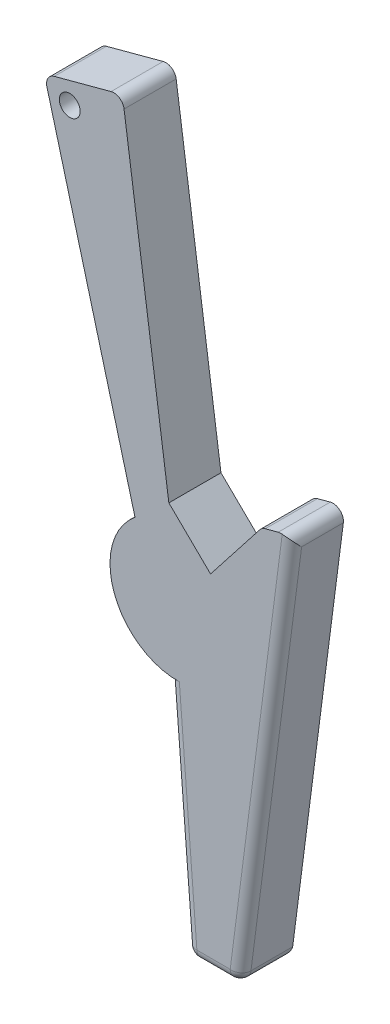
ISO-10303-21;
HEADER;
FILE_DESCRIPTION(('STEP AP214'),'2;1');
FILE_NAME('part.step','',(''),(''),'','','');
FILE_SCHEMA(('AUTOMOTIVE_DESIGN { 1 0 10303 214 1 1 1 1 }'));
ENDSEC;
DATA;
#1=APPLICATION_CONTEXT('core data for automotive mechanical design processes');
#2=APPLICATION_PROTOCOL_DEFINITION('international standard','automotive_design',2000,#1);
#3=PRODUCT_CONTEXT('',#1,'mechanical');
#4=PRODUCT('Part','Part','',(#3));
#5=PRODUCT_RELATED_PRODUCT_CATEGORY('part','',(#4));
#6=PRODUCT_DEFINITION_FORMATION('','',#4);
#7=PRODUCT_DEFINITION_CONTEXT('part definition',#1,'design');
#8=PRODUCT_DEFINITION('design','',#6,#7);
#9=PRODUCT_DEFINITION_SHAPE('','',#8);
#10=(LENGTH_UNIT() NAMED_UNIT(*) SI_UNIT(.MILLI.,.METRE.));
#11=(NAMED_UNIT(*) PLANE_ANGLE_UNIT() SI_UNIT($,.RADIAN.));
#12=(NAMED_UNIT(*) SI_UNIT($,.STERADIAN.) SOLID_ANGLE_UNIT());
#13=UNCERTAINTY_MEASURE_WITH_UNIT(LENGTH_MEASURE(1.E-05),#10,'distance_accuracy_value','');
#14=(GEOMETRIC_REPRESENTATION_CONTEXT(3) GLOBAL_UNCERTAINTY_ASSIGNED_CONTEXT((#13)) GLOBAL_UNIT_ASSIGNED_CONTEXT((#10,
#11,#12)) REPRESENTATION_CONTEXT('',''));
#15=CARTESIAN_POINT('',(0.,0.,0.));
#16=DIRECTION('',(0.,0.,1.));
#17=DIRECTION('',(1.,0.,0.));
#18=AXIS2_PLACEMENT_3D('',#15,#16,#17);
#19=CARTESIAN_POINT('',(-32.260936357535,25.0874873648352,10.));
#20=DIRECTION('',(-0.990268068741571,-0.139173100960062,0.));
#21=DIRECTION('',(0.139173100960062,-0.990268068741571,0.));
#22=AXIS2_PLACEMENT_3D('',#19,#20,#21);
#23=PLANE('',#22);
#24=DIRECTION('',(-0.139173100960062,0.990268068741571,0.));
#25=VECTOR('',#24,1.);
#26=CARTESIAN_POINT('',(-32.260936357535,25.0874873648352,0.));
#27=LINE('',#26,#25);
#28=CARTESIAN_POINT('',(-23.353857896091,-38.2896690346254,0.));
#29=VERTEX_POINT('',#28);
#30=CARTESIAN_POINT('',(-31.9463232080396,22.8488984866514,0.));
#31=VERTEX_POINT('',#30);
#32=EDGE_CURVE('E230',#29,#31,#27,.T.);
#33=ORIENTED_EDGE('',*,*,#32,.T.);
#34=DIRECTION('',(0.,0.,-1.));
#35=VECTOR('',#34,1.);
#36=CARTESIAN_POINT('',(-31.9463232080396,22.8488984866514,10.));
#37=LINE('',#36,#35);
#38=CARTESIAN_POINT('',(-31.9463232080396,22.8488984866514,10.));
#39=VERTEX_POINT('',#38);
#40=EDGE_CURVE('E354',#31,#39,#37,.F.);
#41=ORIENTED_EDGE('',*,*,#40,.T.);
#42=DIRECTION('',(-0.139173100960062,0.990268068741571,0.));
#43=VECTOR('',#42,1.);
#44=CARTESIAN_POINT('',(-32.260936357535,25.0874873648352,10.));
#45=LINE('',#44,#43);
#46=CARTESIAN_POINT('',(-23.353857896091,-38.2896690346254,10.));
#47=VERTEX_POINT('',#46);
#48=EDGE_CURVE('E258',#47,#39,#45,.T.);
#49=ORIENTED_EDGE('',*,*,#48,.F.);
#50=DIRECTION('',(0.,0.,-1.));
#51=VECTOR('',#50,1.);
#52=CARTESIAN_POINT('',(-23.353857896091,-38.2896690346254,10.));
#53=LINE('',#52,#51);
#54=EDGE_CURVE('E229',#47,#29,#53,.T.);
#55=ORIENTED_EDGE('',*,*,#54,.T.);
#56=EDGE_LOOP('',(#33,#41,#49,#55));
#57=FACE_BOUND('',#56,.T.);
#58=ADVANCED_FACE('F47',(#57),#23,.F.);
#59=CARTESIAN_POINT('',(-32.260936357535,25.0874873648352,10.));
#60=DIRECTION('',(0.258819045102515,-0.96592582628907,0.));
#61=DIRECTION('',(0.96592582628907,0.258819045102515,0.));
#62=AXIS2_PLACEMENT_3D('',#59,#60,#61);
#63=PLANE('',#62);
#64=DIRECTION('',(-0.96592582628907,-0.258819045102515,0.));
#65=VECTOR('',#64,1.);
#66=CARTESIAN_POINT('',(-32.260936357535,25.0874873648352,10.));
#67=LINE('',#66,#65);
#68=CARTESIAN_POINT('',(-34.4444974357278,24.5024039373094,10.));
#69=VERTEX_POINT('',#68);
#70=CARTESIAN_POINT('',(-45.3290847049569,21.5858875685735,10.));
#71=VERTEX_POINT('',#70);
#72=EDGE_CURVE('E198',#69,#71,#67,.T.);
#73=ORIENTED_EDGE('',*,*,#72,.F.);
#74=DIRECTION('',(0.,0.,-1.));
#75=VECTOR('',#74,1.);
#76=CARTESIAN_POINT('',(-34.4444974357278,24.5024039373094,10.));
#77=LINE('',#76,#75);
#78=CARTESIAN_POINT('',(-34.4444974357278,24.5024039373094,0.));
#79=VERTEX_POINT('',#78);
#80=EDGE_CURVE('E350',#69,#79,#77,.T.);
#81=ORIENTED_EDGE('',*,*,#80,.T.);
#82=DIRECTION('',(-0.96592582628907,-0.258819045102515,0.));
#83=VECTOR('',#82,1.);
#84=CARTESIAN_POINT('',(-32.260936357535,25.0874873648352,0.));
#85=LINE('',#84,#83);
#86=CARTESIAN_POINT('',(-45.3290847049569,21.5858875685735,0.));
#87=VERTEX_POINT('',#86);
#88=EDGE_CURVE('E234',#79,#87,#85,.T.);
#89=ORIENTED_EDGE('',*,*,#88,.T.);
#90=DIRECTION('',(0.,0.,-1.));
#91=VECTOR('',#90,1.);
#92=CARTESIAN_POINT('',(-45.3290847049569,21.5858875685735,10.));
#93=LINE('',#92,#91);
#94=EDGE_CURVE('E347',#87,#71,#93,.F.);
#95=ORIENTED_EDGE('',*,*,#94,.T.);
#96=EDGE_LOOP('',(#73,#81,#89,#95));
#97=FACE_BOUND('',#96,.T.);
#98=ADVANCED_FACE('F410',(#97),#63,.F.);
#99=CARTESIAN_POINT('',(-47.260936357535,21.0682494783684,10.));
#100=DIRECTION('',(0.96592582628907,0.258819045102515,0.));
#101=DIRECTION('',(-0.258819045102515,0.96592582628907,0.));
#102=AXIS2_PLACEMENT_3D('',#99,#100,#101);
#103=PLANE('',#102);
#104=DIRECTION('',(0.258819045102515,-0.96592582628907,0.));
#105=VECTOR('',#104,1.);
#106=CARTESIAN_POINT('',(-47.260936357535,21.0682494783684,10.));
#107=LINE('',#106,#105);
#108=CARTESIAN_POINT('',(-46.74329826733,19.1363978257903,10.));
#109=VERTEX_POINT('',#108);
#110=CARTESIAN_POINT('',(-29.8442388495125,-43.9317505216316,10.));
#111=VERTEX_POINT('',#110);
#112=EDGE_CURVE('E184',#109,#111,#107,.T.);
#113=ORIENTED_EDGE('',*,*,#112,.F.);
#114=DIRECTION('',(0.,0.,-1.));
#115=VECTOR('',#114,1.);
#116=CARTESIAN_POINT('',(-46.74329826733,19.1363978257903,10.));
#117=LINE('',#116,#115);
#118=CARTESIAN_POINT('',(-46.74329826733,19.1363978257903,0.));
#119=VERTEX_POINT('',#118);
#120=EDGE_CURVE('E357',#109,#119,#117,.T.);
#121=ORIENTED_EDGE('',*,*,#120,.T.);
#122=DIRECTION('',(0.258819045102515,-0.96592582628907,0.));
#123=VECTOR('',#122,1.);
#124=CARTESIAN_POINT('',(-47.260936357535,21.0682494783684,0.));
#125=LINE('',#124,#123);
#126=CARTESIAN_POINT('',(-29.8442388495125,-43.9317505216316,0.));
#127=VERTEX_POINT('',#126);
#128=EDGE_CURVE('E204',#119,#127,#125,.T.);
#129=ORIENTED_EDGE('',*,*,#128,.T.);
#130=DIRECTION('',(0.,0.,-1.));
#131=VECTOR('',#130,1.);
#132=CARTESIAN_POINT('',(-29.8442388495125,-43.9317505216316,10.));
#133=LINE('',#132,#131);
#134=EDGE_CURVE('E201',#111,#127,#133,.T.);
#135=ORIENTED_EDGE('',*,*,#134,.F.);
#136=EDGE_LOOP('',(#113,#121,#129,#135));
#137=FACE_BOUND('',#136,.T.);
#138=ADVANCED_FACE('F202',(#137),#103,.F.);
#139=CARTESIAN_POINT('',(-21.6364687047507,-54.0130455401675,10.));
#140=DIRECTION('',(0.,0.,-1.));
#141=DIRECTION('',(-1.,0.,0.));
#142=AXIS2_PLACEMENT_3D('',#139,#140,#141);
#143=CYLINDRICAL_SURFACE('',#142,13.);
#144=CARTESIAN_POINT('',(-21.6364687047507,-54.0130455401675,0.));
#145=DIRECTION('',(0.,0.,1.));
#146=DIRECTION('',(-1.,0.,0.));
#147=AXIS2_PLACEMENT_3D('',#144,#145,#146);
#148=CIRCLE('',#147,13.);
#149=CARTESIAN_POINT('',(-21.3390263206636,-67.0096423265631,0.));
#150=VERTEX_POINT('',#149);
#151=EDGE_CURVE('E241',#127,#150,#148,.T.);
#152=ORIENTED_EDGE('',*,*,#151,.T.);
#153=CARTESIAN_POINT('',(-21.3390263206636,-67.0096423265631,0.));
#154=CARTESIAN_POINT('',(-21.3953822501953,-67.0109341557258,2.44615307715606E-08));
#155=CARTESIAN_POINT('',(-21.4517185750758,-67.0118542165025,0.00237736128500545));
#156=CARTESIAN_POINT('',(-21.5639937021257,-67.0129644333359,0.0118488644984307));
#157=CARTESIAN_POINT('',(-21.6199325524456,-67.0131546793616,0.0189424493598087));
#158=CARTESIAN_POINT('',(-21.7863914614531,-67.0126522155735,0.0472001940969805));
#159=CARTESIAN_POINT('',(-21.8958054020486,-67.010891870539,0.0753417202891639));
#160=CARTESIAN_POINT('',(-22.108337879366,-67.0049152140536,0.149347031154661));
#161=CARTESIAN_POINT('',(-22.2114556194647,-67.0006985925322,0.195213053051052));
#162=CARTESIAN_POINT('',(-22.4086262227139,-66.9904690703255,0.303338525423184));
#163=CARTESIAN_POINT('',(-22.5026784629808,-66.984456046327,0.36559910126096));
#164=CARTESIAN_POINT('',(-22.6799891693735,-66.971404248818,0.505488039619488));
#165=CARTESIAN_POINT('',(-22.7631329286678,-66.9643560079927,0.583260909459779));
#166=CARTESIAN_POINT('',(-22.9151876917725,-66.9502292661074,0.751690444298816));
#167=CARTESIAN_POINT('',(-22.9840963028593,-66.9431507601642,0.842349270925594));
#168=CARTESIAN_POINT('',(-23.1056702691316,-66.9299028786632,1.03415580843639));
#169=CARTESIAN_POINT('',(-23.1583199408474,-66.9237343838839,1.13531352175072));
#170=CARTESIAN_POINT('',(-23.2455854658772,-66.9131497756352,1.34517870130016));
#171=CARTESIAN_POINT('',(-23.2802156604848,-66.9087322692629,1.45388008535956));
#172=CARTESIAN_POINT('',(-23.3213993444209,-66.9034013128124,1.63609387981203));
#173=CARTESIAN_POINT('',(-23.3335584740009,-66.9018003570721,1.70836671678818));
#174=CARTESIAN_POINT('',(-23.3497891061657,-66.8996491606073,1.85374785190599));
#175=CARTESIAN_POINT('',(-23.3538696233729,-66.8990977487625,1.92685512716886));
#176=CARTESIAN_POINT('',(-23.353857896091,-66.8991067834438,2.));
#177=B_SPLINE_CURVE_WITH_KNOTS('',3,(#153,#154,#155,#156,#157,#158,#159,#160,#161,#162,#163,
#164,#165,#166,#167,#168,#169,#170,#171,#172,#173,#174,#175,#176),.UNSPECIFIED.,.F.,.F.,(4,2,2,
2,2,2,2,2,2,2,2,4),(0.,0.169005718600643,0.337990602115645,0.675215341459116,1.01248265992782,
1.34977313528281,1.69036625645312,2.03101657993061,2.37199447768385,2.71270058216514,
2.93219229259179,3.15143894204799),.UNSPECIFIED.);
#178=CARTESIAN_POINT('',(-23.353857896091,-66.8991067834438,2.));
#179=VERTEX_POINT('',#178);
#180=EDGE_CURVE('E360',#150,#179,#177,.T.);
#181=ORIENTED_EDGE('',*,*,#180,.T.);
#182=DIRECTION('',(0.,0.,-1.));
#183=VECTOR('',#182,1.);
#184=CARTESIAN_POINT('',(-23.353857896091,-66.8991067834438,10.));
#185=LINE('',#184,#183);
#186=CARTESIAN_POINT('',(-23.353857896091,-66.8991067834438,8.));
#187=VERTEX_POINT('',#186);
#188=EDGE_CURVE('E208',#187,#179,#185,.T.);
#189=ORIENTED_EDGE('',*,*,#188,.F.);
#190=CARTESIAN_POINT('',(-23.353857896091,-66.8991067834438,8.));
#191=CARTESIAN_POINT('',(-23.3538584085029,-66.8991045962912,8.05555126358611));
#192=CARTESIAN_POINT('',(-23.3515102525715,-66.8994198952206,8.11107537048463));
#193=CARTESIAN_POINT('',(-23.3421483603841,-66.9006632401932,8.22171521589189));
#194=CARTESIAN_POINT('',(-23.3351351898962,-66.9015912119319,8.27683100310171));
#195=CARTESIAN_POINT('',(-23.3071912703392,-66.9052548487155,8.4407832433558));
#196=CARTESIAN_POINT('',(-23.2793557459437,-66.9088704521257,8.54850395232662));
#197=CARTESIAN_POINT('',(-23.2061635656376,-66.9179825843532,8.75767615199428));
#198=CARTESIAN_POINT('',(-23.1608045693589,-66.923479364402,8.85912680318581));
#199=CARTESIAN_POINT('',(-23.0539557339008,-66.9356463433125,9.0530851843398));
#200=CARTESIAN_POINT('',(-22.9924640483663,-66.9423166764561,9.14559188902538));
#201=CARTESIAN_POINT('',(-22.8542365514319,-66.9560712383667,9.3203491124909));
#202=CARTESIAN_POINT('',(-22.7773129886932,-66.963159719958,9.40245069524474));
#203=CARTESIAN_POINT('',(-22.6108862272373,-66.9767436521108,9.55282092782577));
#204=CARTESIAN_POINT('',(-22.5213800698397,-66.9832389625992,9.62108631495462));
#205=CARTESIAN_POINT('',(-22.3308904482378,-66.9948406447174,9.74279627105821));
#206=CARTESIAN_POINT('',(-22.229760309693,-66.9999256756448,9.79601333807569));
#207=CARTESIAN_POINT('',(-22.0199541348421,-67.0078109780349,9.88472591238333));
#208=CARTESIAN_POINT('',(-21.9112830958284,-67.0106127471984,9.920233030537));
#209=CARTESIAN_POINT('',(-21.7248621569916,-67.0129650641914,9.96413726103168));
#210=CARTESIAN_POINT('',(-21.6482690119293,-67.0132661907211,9.97756478400061));
#211=CARTESIAN_POINT('',(-21.4941331357508,-67.0124972031889,9.99549833977836));
#212=CARTESIAN_POINT('',(-21.4165914617644,-67.0114284984603,10.0000135297935));
#213=CARTESIAN_POINT('',(-21.3390263206636,-67.0096423265631,10.));
#214=B_SPLINE_CURVE_WITH_KNOTS('',3,(#190,#191,#192,#193,#194,#195,#196,#197,#198,#199,#200,
#201,#202,#203,#204,#205,#206,#207,#208,#209,#210,#211,#212,#213),.UNSPECIFIED.,.F.,.F.,(4,2,2,
2,2,2,2,2,2,2,2,4),(0.,0.166549658643739,0.333079121996872,0.665310755854277,0.99758677665173,
1.32990084239973,1.66653425546993,2.00324695758204,2.34480685162012,2.68614251941128,
2.91892963000214,3.15147743270999),.UNSPECIFIED.);
#215=CARTESIAN_POINT('',(-21.3390263206636,-67.0096423265631,10.));
#216=VERTEX_POINT('',#215);
#217=EDGE_CURVE('E213',#187,#216,#214,.T.);
#218=ORIENTED_EDGE('',*,*,#217,.T.);
#219=CARTESIAN_POINT('',(-21.6364687047507,-54.0130455401675,10.));
#220=DIRECTION('',(0.,0.,1.));
#221=DIRECTION('',(-1.,0.,0.));
#222=AXIS2_PLACEMENT_3D('',#219,#220,#221);
#223=CIRCLE('',#222,13.);
#224=EDGE_CURVE('E189',#111,#216,#223,.T.);
#225=ORIENTED_EDGE('',*,*,#224,.F.);
#226=ORIENTED_EDGE('',*,*,#134,.T.);
#227=EDGE_LOOP('',(#152,#181,#189,#218,#225,#226));
#228=FACE_BOUND('',#227,.T.);
#229=ADVANCED_FACE('F210',(#228),#143,.T.);
#230=CARTESIAN_POINT('',(-19.821063105749,-111.899106783444,10.));
#231=DIRECTION('',(0.996932532714429,0.0782657346199105,0.));
#232=DIRECTION('',(-0.0782657346199105,0.996932532714429,0.));
#233=AXIS2_PLACEMENT_3D('',#230,#231,#232);
#234=PLANE('',#233);
#235=DIRECTION('',(0.0782657346199105,-0.996932532714429,0.));
#236=VECTOR('',#235,1.);
#237=CARTESIAN_POINT('',(-19.821063105749,-111.899106783444,2.));
#238=LINE('',#237,#236);
#239=CARTESIAN_POINT('',(-19.9657874617852,-110.055638252684,2.));
#240=VERTEX_POINT('',#239);
#241=EDGE_CURVE('E305',#179,#240,#238,.T.);
#242=ORIENTED_EDGE('',*,*,#241,.T.);
#243=DIRECTION('',(0.,0.,-1.));
#244=VECTOR('',#243,1.);
#245=CARTESIAN_POINT('',(-19.9657874617852,-110.055638252684,10.));
#246=LINE('',#245,#244);
#247=CARTESIAN_POINT('',(-19.9657874617852,-110.055638252684,8.));
#248=VERTEX_POINT('',#247);
#249=EDGE_CURVE('E11',#240,#248,#246,.F.);
#250=ORIENTED_EDGE('',*,*,#249,.T.);
#251=DIRECTION('',(0.0782657346199105,-0.996932532714429,0.));
#252=VECTOR('',#251,1.);
#253=CARTESIAN_POINT('',(-19.821063105749,-111.899106783444,8.));
#254=LINE('',#253,#252);
#255=EDGE_CURVE('E302',#248,#187,#254,.F.);
#256=ORIENTED_EDGE('',*,*,#255,.T.);
#257=ORIENTED_EDGE('',*,*,#188,.T.);
#258=EDGE_LOOP('',(#242,#250,#256,#257));
#259=FACE_BOUND('',#258,.T.);
#260=ADVANCED_FACE('F514',(#259),#234,.F.);
#261=CARTESIAN_POINT('',(-9.82106310574905,-111.899106783444,10.));
#262=DIRECTION('',(0.,1.,0.));
#263=DIRECTION('',(0.,0.,1.));
#264=AXIS2_PLACEMENT_3D('',#261,#262,#263);
#265=PLANE('',#264);
#266=DIRECTION('',(1.,0.,0.));
#267=VECTOR('',#266,1.);
#268=CARTESIAN_POINT('',(-9.82106310574905,-111.899106783444,8.));
#269=LINE('',#268,#267);
#270=CARTESIAN_POINT('',(-11.5794808287493,-111.899106783444,8.));
#271=VERTEX_POINT('',#270);
#272=CARTESIAN_POINT('',(-17.9719223963564,-111.899106783444,8.));
#273=VERTEX_POINT('',#272);
#274=EDGE_CURVE('E331',#271,#273,#269,.F.);
#275=ORIENTED_EDGE('',*,*,#274,.T.);
#276=DIRECTION('',(0.,0.,-1.));
#277=VECTOR('',#276,1.);
#278=CARTESIAN_POINT('',(-17.9719223963564,-111.899106783444,10.));
#279=LINE('',#278,#277);
#280=CARTESIAN_POINT('',(-17.9719223963564,-111.899106783444,2.));
#281=VERTEX_POINT('',#280);
#282=EDGE_CURVE('E57',#273,#281,#279,.T.);
#283=ORIENTED_EDGE('',*,*,#282,.T.);
#284=DIRECTION('',(1.,0.,0.));
#285=VECTOR('',#284,1.);
#286=CARTESIAN_POINT('',(-9.82106310574905,-111.899106783444,2.));
#287=LINE('',#286,#285);
#288=CARTESIAN_POINT('',(-11.5794808287493,-111.899106783444,2.));
#289=VERTEX_POINT('',#288);
#290=EDGE_CURVE('E334',#281,#289,#287,.T.);
#291=ORIENTED_EDGE('',*,*,#290,.T.);
#292=DIRECTION('',(0.,0.,-1.));
#293=VECTOR('',#292,1.);
#294=CARTESIAN_POINT('',(-11.5794808287493,-111.899106783444,10.));
#295=LINE('',#294,#293);
#296=EDGE_CURVE('E328',#289,#271,#295,.F.);
#297=ORIENTED_EDGE('',*,*,#296,.T.);
#298=EDGE_LOOP('',(#275,#283,#291,#297));
#299=FACE_BOUND('',#298,.T.);
#300=ADVANCED_FACE('F516',(#299),#265,.F.);
#301=CARTESIAN_POINT('',(0.506029251913318,-31.8991067834437,10.));
#302=DIRECTION('',(-0.991770766227759,0.128026353755795,0.));
#303=DIRECTION('',(-0.128026353755795,-0.991770766227759,0.));
#304=AXIS2_PLACEMENT_3D('',#301,#302,#303);
#305=PLANE('',#304);
#306=DIRECTION('',(0.,0.,-1.));
#307=VECTOR('',#306,1.);
#308=CARTESIAN_POINT('',(-9.59593929629376,-110.155159490955,10.));
#309=LINE('',#308,#307);
#310=CARTESIAN_POINT('',(-9.59593929629376,-110.155159490955,8.));
#311=VERTEX_POINT('',#310);
#312=CARTESIAN_POINT('',(-9.59593929629376,-110.155159490955,0.0164584675444793));
#313=VERTEX_POINT('',#312);
#314=EDGE_CURVE('E296',#311,#313,#309,.T.);
#315=ORIENTED_EDGE('',*,*,#314,.T.);
#316=CARTESIAN_POINT('',(-9.56288579680749,-109.899106783444,2.));
#317=DIRECTION('',(-0.991770766227759,0.128026353755795,0.));
#318=DIRECTION('',(-0.128026353755795,-0.991770766227759,0.));
#319=AXIS2_PLACEMENT_3D('',#316,#317,#318);
#320=ELLIPSE('',#319,2.01659503194179,2.);
#321=CARTESIAN_POINT('',(-9.56288579680749,-109.899106783444,0.));
#322=VERTEX_POINT('',#321);
#323=EDGE_CURVE('E299',#313,#322,#320,.F.);
#324=ORIENTED_EDGE('',*,*,#323,.T.);
#325=DIRECTION('',(0.128026353755795,0.991770766227759,0.));
#326=VECTOR('',#325,1.);
#327=CARTESIAN_POINT('',(0.506029251913318,-31.8991067834437,0.));
#328=LINE('',#327,#326);
#329=CARTESIAN_POINT('',(0.123862992505857,-34.8596013441332,0.));
#330=VERTEX_POINT('',#329);
#331=EDGE_CURVE('E244',#322,#330,#328,.T.);
#332=ORIENTED_EDGE('',*,*,#331,.T.);
#333=DIRECTION('',(0.,0.,-1.));
#334=VECTOR('',#333,1.);
#335=CARTESIAN_POINT('',(0.123862992505857,-34.8596013441332,10.));
#336=LINE('',#335,#334);
#337=CARTESIAN_POINT('',(0.123862992505857,-34.8596013441332,8.));
#338=VERTEX_POINT('',#337);
#339=EDGE_CURVE('E290',#330,#338,#336,.F.);
#340=ORIENTED_EDGE('',*,*,#339,.T.);
#341=DIRECTION('',(0.128026353755795,0.991770766227759,0.));
#342=VECTOR('',#341,1.);
#343=CARTESIAN_POINT('',(0.506029251913318,-31.8991067834437,8.));
#344=LINE('',#343,#342);
#345=EDGE_CURVE('E293',#338,#311,#344,.F.);
#346=ORIENTED_EDGE('',*,*,#345,.T.);
#347=EDGE_LOOP('',(#315,#324,#332,#340,#346));
#348=FACE_BOUND('',#347,.T.);
#349=ADVANCED_FACE('F506',(#348),#305,.F.);
#350=CARTESIAN_POINT('',(-5.49397074808668,-33.5068019380304,10.));
#351=DIRECTION('',(0.258819045102515,-0.96592582628907,0.));
#352=DIRECTION('',(0.96592582628907,0.258819045102515,0.));
#353=AXIS2_PLACEMENT_3D('',#350,#351,#352);
#354=PLANE('',#353);
#355=DIRECTION('',(-0.96592582628907,-0.258819045102515,0.));
#356=VECTOR('',#355,1.);
#357=CARTESIAN_POINT('',(-5.49397074808668,-33.5068019380304,10.));
#358=LINE('',#357,#356);
#359=CARTESIAN_POINT('',(-2.37731663015469,-32.6716969840434,10.));
#360=VERTEX_POINT('',#359);
#361=CARTESIAN_POINT('',(-4.84837490828968,-33.3338150541199,10.));
#362=VERTEX_POINT('',#361);
#363=EDGE_CURVE('E216',#360,#362,#358,.T.);
#364=ORIENTED_EDGE('',*,*,#363,.F.);
#365=DIRECTION('',(0.,0.,-1.));
#366=VECTOR('',#365,1.);
#367=CARTESIAN_POINT('',(-2.37731663015469,-32.6716969840434,10.));
#368=LINE('',#367,#366);
#369=CARTESIAN_POINT('',(-2.37731663015469,-32.6716969840434,0.));
#370=VERTEX_POINT('',#369);
#371=EDGE_CURVE('E340',#360,#370,#368,.T.);
#372=ORIENTED_EDGE('',*,*,#371,.T.);
#373=DIRECTION('',(-0.96592582628907,-0.258819045102515,0.));
#374=VECTOR('',#373,1.);
#375=CARTESIAN_POINT('',(-5.49397074808668,-33.5068019380304,0.));
#376=LINE('',#375,#374);
#377=CARTESIAN_POINT('',(-4.84837490828968,-33.3338150541199,0.));
#378=VERTEX_POINT('',#377);
#379=EDGE_CURVE('E248',#370,#378,#376,.T.);
#380=ORIENTED_EDGE('',*,*,#379,.T.);
#381=DIRECTION('',(0.,0.,-1.));
#382=VECTOR('',#381,1.);
#383=CARTESIAN_POINT('',(-4.84837490828968,-33.3338150541199,10.));
#384=LINE('',#383,#382);
#385=EDGE_CURVE('E337',#378,#362,#384,.F.);
#386=ORIENTED_EDGE('',*,*,#385,.T.);
#387=EDGE_LOOP('',(#364,#372,#380,#386));
#388=FACE_BOUND('',#387,.T.);
#389=ADVANCED_FACE('F525',(#388),#354,.F.);
#390=CARTESIAN_POINT('',(-15.353857896091,-46.1076997405133,10.));
#391=DIRECTION('',(0.787556112655182,-0.616242946750272,0.));
#392=DIRECTION('',(0.616242946750272,0.787556112655182,0.));
#393=AXIS2_PLACEMENT_3D('',#390,#391,#392);
#394=PLANE('',#393);
#395=DIRECTION('',(-0.616242946750272,-0.787556112655182,0.));
#396=VECTOR('',#395,1.);
#397=CARTESIAN_POINT('',(-15.353857896091,-46.1076997405133,10.));
#398=LINE('',#397,#396);
#399=CARTESIAN_POINT('',(-5.90584904339501,-34.0331808131975,10.));
#400=VERTEX_POINT('',#399);
#401=CARTESIAN_POINT('',(-15.353857896091,-46.1076997405133,10.));
#402=VERTEX_POINT('',#401);
#403=EDGE_CURVE('E220',#400,#402,#398,.T.);
#404=ORIENTED_EDGE('',*,*,#403,.F.);
#405=DIRECTION('',(0.,0.,-1.));
#406=VECTOR('',#405,1.);
#407=CARTESIAN_POINT('',(-5.90584904339501,-34.0331808131975,10.));
#408=LINE('',#407,#406);
#409=CARTESIAN_POINT('',(-5.90584904339501,-34.0331808131975,0.));
#410=VERTEX_POINT('',#409);
#411=EDGE_CURVE('E343',#400,#410,#408,.T.);
#412=ORIENTED_EDGE('',*,*,#411,.T.);
#413=DIRECTION('',(-0.616242946750272,-0.787556112655182,0.));
#414=VECTOR('',#413,1.);
#415=CARTESIAN_POINT('',(-15.353857896091,-46.1076997405133,0.));
#416=LINE('',#415,#414);
#417=CARTESIAN_POINT('',(-15.353857896091,-46.1076997405133,0.));
#418=VERTEX_POINT('',#417);
#419=EDGE_CURVE('E252',#410,#418,#416,.T.);
#420=ORIENTED_EDGE('',*,*,#419,.T.);
#421=DIRECTION('',(0.,0.,-1.));
#422=VECTOR('',#421,1.);
#423=CARTESIAN_POINT('',(-15.353857896091,-46.1076997405133,10.));
#424=LINE('',#423,#422);
#425=EDGE_CURVE('E262',#402,#418,#424,.T.);
#426=ORIENTED_EDGE('',*,*,#425,.F.);
#427=EDGE_LOOP('',(#404,#412,#420,#426));
#428=FACE_BOUND('',#427,.T.);
#429=ADVANCED_FACE('F528',(#428),#394,.F.);
#430=CARTESIAN_POINT('',(-23.353857896091,-38.2896690346254,10.));
#431=DIRECTION('',(-0.69892603784685,-0.715193955245501,0.));
#432=DIRECTION('',(0.715193955245501,-0.69892603784685,0.));
#433=AXIS2_PLACEMENT_3D('',#430,#431,#432);
#434=PLANE('',#433);
#435=DIRECTION('',(-0.715193955245501,0.69892603784685,0.));
#436=VECTOR('',#435,1.);
#437=CARTESIAN_POINT('',(-23.353857896091,-38.2896690346254,0.));
#438=LINE('',#437,#436);
#439=EDGE_CURVE('E255',#418,#29,#438,.T.);
#440=ORIENTED_EDGE('',*,*,#439,.T.);
#441=ORIENTED_EDGE('',*,*,#54,.F.);
#442=DIRECTION('',(-0.715193955245501,0.69892603784685,0.));
#443=VECTOR('',#442,1.);
#444=CARTESIAN_POINT('',(-23.353857896091,-38.2896690346254,10.));
#445=LINE('',#444,#443);
#446=EDGE_CURVE('E226',#402,#47,#445,.T.);
#447=ORIENTED_EDGE('',*,*,#446,.F.);
#448=ORIENTED_EDGE('',*,*,#425,.T.);
#449=EDGE_LOOP('',(#440,#441,#447,#448));
#450=FACE_BOUND('',#449,.T.);
#451=ADVANCED_FACE('F532',(#450),#434,.F.);
#452=CARTESIAN_POINT('',(-21.6364687047507,-54.0130455401675,10.));
#453=DIRECTION('',(0.,0.,-1.));
#454=DIRECTION('',(-1.,0.,0.));
#455=AXIS2_PLACEMENT_3D('',#452,#453,#454);
#456=PLANE('',#455);
#457=CARTESIAN_POINT('',(-42.3619568719687,18.2398223536222,10.));
#458=DIRECTION('',(0.,0.,1.));
#459=DIRECTION('',(1.,0.,0.));
#460=AXIS2_PLACEMENT_3D('',#457,#458,#459);
#461=CIRCLE('',#460,2.);
#462=CARTESIAN_POINT('',(-40.3619568719687,18.2398223536222,10.));
#463=VERTEX_POINT('',#462);
#464=EDGE_CURVE('E475',#463,#463,#461,.T.);
#465=ORIENTED_EDGE('',*,*,#464,.F.);
#466=EDGE_LOOP('',(#465));
#467=FACE_BOUND('',#466,.T.);
#468=ORIENTED_EDGE('',*,*,#224,.T.);
#469=DIRECTION('',(0.0782657346199105,-0.996932532714429,0.));
#470=VECTOR('',#469,1.);
#471=CARTESIAN_POINT('',(-22.354916315022,-54.0694483840497,10.));
#472=LINE('',#471,#470);
#473=CARTESIAN_POINT('',(-17.9719223963564,-109.899106783444,10.));
#474=VERTEX_POINT('',#473);
#475=EDGE_CURVE('E287',#216,#474,#472,.T.);
#476=ORIENTED_EDGE('',*,*,#475,.T.);
#477=DIRECTION('',(1.,0.,0.));
#478=VECTOR('',#477,1.);
#479=CARTESIAN_POINT('',(-21.6364687047507,-109.899106783444,10.));
#480=LINE('',#479,#478);
#481=CARTESIAN_POINT('',(-11.5794808287493,-109.899106783444,10.));
#482=VERTEX_POINT('',#481);
#483=EDGE_CURVE('E284',#474,#482,#480,.T.);
#484=ORIENTED_EDGE('',*,*,#483,.T.);
#485=DIRECTION('',(0.128026353755795,0.991770766227759,0.));
#486=VECTOR('',#485,1.);
#487=CARTESIAN_POINT('',(-4.64831297972023,-56.2060237046517,10.));
#488=LINE('',#487,#486);
#489=CARTESIAN_POINT('',(-1.60362583243807,-32.6200071041661,10.));
#490=VERTEX_POINT('',#489);
#491=EDGE_CURVE('E280',#482,#490,#488,.T.);
#492=ORIENTED_EDGE('',*,*,#491,.T.);
#493=CARTESIAN_POINT('',(-1.85967853994966,-34.6035486366216,10.));
#494=DIRECTION('',(0.,0.,-1.));
#495=DIRECTION('',(-1.,0.,0.));
#496=AXIS2_PLACEMENT_3D('',#493,#494,#495);
#497=CIRCLE('',#496,2.);
#498=EDGE_CURVE('E277',#490,#360,#497,.F.);
#499=ORIENTED_EDGE('',*,*,#498,.T.);
#500=ORIENTED_EDGE('',*,*,#363,.T.);
#501=CARTESIAN_POINT('',(-4.33073681808465,-35.2656667066981,10.));
#502=DIRECTION('',(0.,0.,-1.));
#503=DIRECTION('',(-1.,0.,0.));
#504=AXIS2_PLACEMENT_3D('',#501,#502,#503);
#505=CIRCLE('',#504,2.);
#506=EDGE_CURVE('E274',#362,#400,#505,.F.);
#507=ORIENTED_EDGE('',*,*,#506,.T.);
#508=ORIENTED_EDGE('',*,*,#403,.T.);
#509=ORIENTED_EDGE('',*,*,#446,.T.);
#510=ORIENTED_EDGE('',*,*,#48,.T.);
#511=CARTESIAN_POINT('',(-33.9268593455227,22.5705522847313,10.));
#512=DIRECTION('',(0.,0.,-1.));
#513=DIRECTION('',(-1.,0.,0.));
#514=AXIS2_PLACEMENT_3D('',#511,#512,#513);
#515=CIRCLE('',#514,2.);
#516=EDGE_CURVE('E271',#39,#69,#515,.F.);
#517=ORIENTED_EDGE('',*,*,#516,.T.);
#518=ORIENTED_EDGE('',*,*,#72,.T.);
#519=CARTESIAN_POINT('',(-44.8114466147519,19.6540359159953,10.));
#520=DIRECTION('',(0.,0.,-1.));
#521=DIRECTION('',(-1.,0.,0.));
#522=AXIS2_PLACEMENT_3D('',#519,#520,#521);
#523=CIRCLE('',#522,2.);
#524=EDGE_CURVE('E193',#71,#109,#523,.F.);
#525=ORIENTED_EDGE('',*,*,#524,.T.);
#526=ORIENTED_EDGE('',*,*,#112,.T.);
#527=EDGE_LOOP('',(#468,#476,#484,#492,#499,#500,#507,#508,#509,#510,#517,#518,#525,#526));
#528=FACE_BOUND('',#527,.T.);
#529=ADVANCED_FACE('F186',(#467,#528),#456,.F.);
#530=CARTESIAN_POINT('',(-21.6364687047507,-54.0130455401675,0.));
#531=DIRECTION('',(0.,0.,-1.));
#532=DIRECTION('',(-1.,0.,0.));
#533=AXIS2_PLACEMENT_3D('',#530,#531,#532);
#534=PLANE('',#533);
#535=CARTESIAN_POINT('',(-42.3619568719687,18.2398223536222,0.));
#536=DIRECTION('',(0.,0.,1.));
#537=DIRECTION('',(1.,0.,0.));
#538=AXIS2_PLACEMENT_3D('',#535,#536,#537);
#539=CIRCLE('',#538,2.);
#540=CARTESIAN_POINT('',(-40.3619568719687,18.2398223536222,0.));
#541=VERTEX_POINT('',#540);
#542=EDGE_CURVE('E235',#541,#541,#539,.T.);
#543=ORIENTED_EDGE('',*,*,#542,.T.);
#544=EDGE_LOOP('',(#543));
#545=FACE_BOUND('',#544,.T.);
#546=DIRECTION('',(0.0782657346199105,-0.996932532714429,0.));
#547=VECTOR('',#546,1.);
#548=CARTESIAN_POINT('',(-21.3599928306622,-66.7425753142039,0.));
#549=LINE('',#548,#547);
#550=CARTESIAN_POINT('',(-17.9719223963564,-109.899106783444,0.));
#551=VERTEX_POINT('',#550);
#552=EDGE_CURVE('E324',#551,#150,#549,.F.);
#553=ORIENTED_EDGE('',*,*,#552,.T.);
#554=ORIENTED_EDGE('',*,*,#151,.F.);
#555=ORIENTED_EDGE('',*,*,#128,.F.);
#556=CARTESIAN_POINT('',(-44.8114466147519,19.6540359159953,0.));
#557=DIRECTION('',(0.,0.,-1.));
#558=DIRECTION('',(-1.,0.,0.));
#559=AXIS2_PLACEMENT_3D('',#556,#557,#558);
#560=CIRCLE('',#559,2.);
#561=EDGE_CURVE('E308',#119,#87,#560,.T.);
#562=ORIENTED_EDGE('',*,*,#561,.T.);
#563=ORIENTED_EDGE('',*,*,#88,.F.);
#564=CARTESIAN_POINT('',(-33.9268593455227,22.5705522847313,0.));
#565=DIRECTION('',(0.,0.,-1.));
#566=DIRECTION('',(-1.,0.,0.));
#567=AXIS2_PLACEMENT_3D('',#564,#565,#566);
#568=CIRCLE('',#567,2.);
#569=EDGE_CURVE('E311',#79,#31,#568,.T.);
#570=ORIENTED_EDGE('',*,*,#569,.T.);
#571=ORIENTED_EDGE('',*,*,#32,.F.);
#572=ORIENTED_EDGE('',*,*,#439,.F.);
#573=ORIENTED_EDGE('',*,*,#419,.F.);
#574=CARTESIAN_POINT('',(-4.33073681808465,-35.2656667066981,0.));
#575=DIRECTION('',(0.,0.,-1.));
#576=DIRECTION('',(-1.,0.,0.));
#577=AXIS2_PLACEMENT_3D('',#574,#575,#576);
#578=CIRCLE('',#577,2.);
#579=EDGE_CURVE('E314',#410,#378,#578,.T.);
#580=ORIENTED_EDGE('',*,*,#579,.T.);
#581=ORIENTED_EDGE('',*,*,#379,.F.);
#582=CARTESIAN_POINT('',(-1.85967853994966,-34.6035486366216,0.));
#583=DIRECTION('',(0.,0.,-1.));
#584=DIRECTION('',(-1.,0.,0.));
#585=AXIS2_PLACEMENT_3D('',#582,#583,#584);
#586=CIRCLE('',#585,2.);
#587=EDGE_CURVE('E317',#370,#330,#586,.T.);
#588=ORIENTED_EDGE('',*,*,#587,.T.);
#589=ORIENTED_EDGE('',*,*,#331,.F.);
#590=DIRECTION('',(1.,0.,0.));
#591=VECTOR('',#590,1.);
#592=CARTESIAN_POINT('',(-19.821063105749,-109.899106783444,0.));
#593=LINE('',#592,#591);
#594=EDGE_CURVE('E320',#322,#551,#593,.F.);
#595=ORIENTED_EDGE('',*,*,#594,.T.);
#596=EDGE_LOOP('',(#553,#554,#555,#562,#563,#570,#571,#572,#573,#580,#581,#588,#589,#595));
#597=FACE_BOUND('',#596,.T.);
#598=ADVANCED_FACE('F511',(#545,#597),#534,.T.);
#599=CARTESIAN_POINT('',(-42.3619568719687,18.2398223536222,0.));
#600=DIRECTION('',(0.,0.,1.));
#601=DIRECTION('',(1.,0.,0.));
#602=AXIS2_PLACEMENT_3D('',#599,#600,#601);
#603=CYLINDRICAL_SURFACE('',#602,2.);
#604=ORIENTED_EDGE('',*,*,#542,.F.);
#605=EDGE_LOOP('',(#604));
#606=FACE_BOUND('',#605,.T.);
#607=ORIENTED_EDGE('',*,*,#464,.T.);
#608=EDGE_LOOP('',(#607));
#609=FACE_BOUND('',#608,.T.);
#610=ADVANCED_FACE('F384',(#606,#609),#603,.F.);
#611=CARTESIAN_POINT('',(-17.8271980403202,-111.742575314204,2.));
#612=DIRECTION('',(-0.0782657346199105,0.996932532714429,0.));
#613=DIRECTION('',(-0.996932532714429,-0.0782657346199105,0.));
#614=AXIS2_PLACEMENT_3D('',#611,#612,#613);
#615=CYLINDRICAL_SURFACE('',#614,2.);
#616=ORIENTED_EDGE('',*,*,#552,.F.);
#617=CARTESIAN_POINT('',(-17.9719223963564,-109.899106783444,2.));
#618=DIRECTION('',(-0.0782657346199105,0.996932532714429,0.));
#619=DIRECTION('',(-0.996932532714429,-0.0782657346199105,0.));
#620=AXIS2_PLACEMENT_3D('',#617,#618,#619);
#621=CIRCLE('',#620,2.);
#622=EDGE_CURVE('E65',#551,#240,#621,.T.);
#623=ORIENTED_EDGE('',*,*,#622,.T.);
#624=ORIENTED_EDGE('',*,*,#241,.F.);
#625=ORIENTED_EDGE('',*,*,#180,.F.);
#626=EDGE_LOOP('',(#616,#623,#624,#625));
#627=FACE_BOUND('',#626,.T.);
#628=ADVANCED_FACE('F378',(#627),#615,.T.);
#629=CARTESIAN_POINT('',(-9.82106310574905,-109.899106783444,2.));
#630=DIRECTION('',(-1.,0.,0.));
#631=DIRECTION('',(0.,0.,1.));
#632=AXIS2_PLACEMENT_3D('',#629,#630,#631);
#633=CYLINDRICAL_SURFACE('',#632,2.);
#634=ORIENTED_EDGE('',*,*,#290,.F.);
#635=CARTESIAN_POINT('',(-17.9719223963564,-109.899106783444,2.));
#636=DIRECTION('',(-1.,0.,0.));
#637=DIRECTION('',(0.,0.,1.));
#638=AXIS2_PLACEMENT_3D('',#635,#636,#637);
#639=CIRCLE('',#638,2.);
#640=EDGE_CURVE('E456',#281,#551,#639,.F.);
#641=ORIENTED_EDGE('',*,*,#640,.T.);
#642=ORIENTED_EDGE('',*,*,#594,.F.);
#643=ORIENTED_EDGE('',*,*,#323,.F.);
#644=CARTESIAN_POINT('',(-11.5794808287493,-109.899106783444,2.));
#645=DIRECTION('',(-0.707106781186548,0.,-0.707106781186547));
#646=DIRECTION('',(0.707106781186548,0.,-0.707106781186547));
#647=AXIS2_PLACEMENT_3D('',#644,#645,#646);
#648=ELLIPSE('',#647,2.82842712474619,2.);
#649=EDGE_CURVE('E471',#289,#313,#648,.F.);
#650=ORIENTED_EDGE('',*,*,#649,.F.);
#651=EDGE_LOOP('',(#634,#641,#642,#643,#650));
#652=FACE_BOUND('',#651,.T.);
#653=ADVANCED_FACE('F383',(#652),#633,.T.);
#654=CARTESIAN_POINT('',(-22.354916315022,-54.0694483840497,8.));
#655=DIRECTION('',(0.0782657346199105,-0.996932532714429,0.));
#656=DIRECTION('',(0.996932532714429,0.0782657346199105,0.));
#657=AXIS2_PLACEMENT_3D('',#654,#655,#656);
#658=CYLINDRICAL_SURFACE('',#657,2.);
#659=ORIENTED_EDGE('',*,*,#255,.F.);
#660=CARTESIAN_POINT('',(-17.9719223963564,-109.899106783444,8.));
#661=DIRECTION('',(0.0782657346199105,-0.996932532714429,0.));
#662=DIRECTION('',(0.996932532714429,0.0782657346199105,0.));
#663=AXIS2_PLACEMENT_3D('',#660,#661,#662);
#664=CIRCLE('',#663,2.);
#665=EDGE_CURVE('E448',#248,#474,#664,.F.);
#666=ORIENTED_EDGE('',*,*,#665,.T.);
#667=ORIENTED_EDGE('',*,*,#475,.F.);
#668=ORIENTED_EDGE('',*,*,#217,.F.);
#669=EDGE_LOOP('',(#659,#666,#667,#668));
#670=FACE_BOUND('',#669,.T.);
#671=ADVANCED_FACE('F437',(#670),#658,.T.);
#672=CARTESIAN_POINT('',(-11.5794808287493,-109.899106783444,10.));
#673=DIRECTION('',(0.,0.,-1.));
#674=DIRECTION('',(-1.,0.,0.));
#675=AXIS2_PLACEMENT_3D('',#672,#673,#674);
#676=CYLINDRICAL_SURFACE('',#675,2.);
#677=ORIENTED_EDGE('',*,*,#649,.T.);
#678=ORIENTED_EDGE('',*,*,#314,.F.);
#679=CARTESIAN_POINT('',(-11.5794808287493,-109.899106783444,8.));
#680=DIRECTION('',(0.,0.,1.));
#681=DIRECTION('',(1.,0.,0.));
#682=AXIS2_PLACEMENT_3D('',#679,#680,#681);
#683=CIRCLE('',#682,2.);
#684=EDGE_CURVE('E476',#271,#311,#683,.T.);
#685=ORIENTED_EDGE('',*,*,#684,.F.);
#686=ORIENTED_EDGE('',*,*,#296,.F.);
#687=EDGE_LOOP('',(#677,#678,#685,#686));
#688=FACE_BOUND('',#687,.T.);
#689=ADVANCED_FACE('F434',(#688),#676,.T.);
#690=CARTESIAN_POINT('',(-21.6364687047507,-109.899106783444,8.));
#691=DIRECTION('',(1.,0.,0.));
#692=DIRECTION('',(0.,0.,-1.));
#693=AXIS2_PLACEMENT_3D('',#690,#691,#692);
#694=CYLINDRICAL_SURFACE('',#693,2.);
#695=ORIENTED_EDGE('',*,*,#483,.F.);
#696=CARTESIAN_POINT('',(-17.9719223963564,-109.899106783444,8.));
#697=DIRECTION('',(1.,0.,0.));
#698=DIRECTION('',(0.,0.,-1.));
#699=AXIS2_PLACEMENT_3D('',#696,#697,#698);
#700=CIRCLE('',#699,2.);
#701=EDGE_CURVE('E454',#474,#273,#700,.T.);
#702=ORIENTED_EDGE('',*,*,#701,.T.);
#703=ORIENTED_EDGE('',*,*,#274,.F.);
#704=CARTESIAN_POINT('',(-11.5794808287493,-109.899106783444,8.));
#705=DIRECTION('',(1.,0.,0.));
#706=DIRECTION('',(0.,1.,0.));
#707=AXIS2_PLACEMENT_3D('',#704,#705,#706);
#708=CIRCLE('',#707,2.);
#709=EDGE_CURVE('E480',#482,#271,#708,.T.);
#710=ORIENTED_EDGE('',*,*,#709,.F.);
#711=EDGE_LOOP('',(#695,#702,#703,#710));
#712=FACE_BOUND('',#711,.T.);
#713=ADVANCED_FACE('F430',(#712),#694,.T.);
#714=CARTESIAN_POINT('',(-11.5794808287493,-109.899106783444,8.));
#715=DIRECTION('',(0.,0.,1.));
#716=DIRECTION('',(1.,0.,0.));
#717=AXIS2_PLACEMENT_3D('',#714,#715,#716);
#718=SPHERICAL_SURFACE('',#717,2.);
#719=ORIENTED_EDGE('',*,*,#709,.T.);
#720=ORIENTED_EDGE('',*,*,#684,.T.);
#721=CARTESIAN_POINT('',(-11.5794808287493,-109.899106783444,8.));
#722=DIRECTION('',(-0.128026353755799,-0.991770766227758,0.));
#723=DIRECTION('',(0.991770766227758,-0.128026353755799,0.));
#724=AXIS2_PLACEMENT_3D('',#721,#722,#723);
#725=CIRCLE('',#724,2.);
#726=EDGE_CURVE('E484',#482,#311,#725,.F.);
#727=ORIENTED_EDGE('',*,*,#726,.F.);
#728=EDGE_LOOP('',(#719,#720,#727));
#729=FACE_BOUND('',#728,.T.);
#730=ADVANCED_FACE('F426',(#729),#718,.T.);
#731=CARTESIAN_POINT('',(-1.85967853994966,-34.6035486366216,10.));
#732=DIRECTION('',(0.,0.,-1.));
#733=DIRECTION('',(-1.,0.,0.));
#734=AXIS2_PLACEMENT_3D('',#731,#732,#733);
#735=CYLINDRICAL_SURFACE('',#734,2.);
#736=ORIENTED_EDGE('',*,*,#371,.F.);
#737=ORIENTED_EDGE('',*,*,#498,.F.);
#738=CARTESIAN_POINT('',(-1.85967853994966,-34.6035486366216,8.));
#739=DIRECTION('',(0.0905283029113108,0.701287834182226,-0.707106781186547));
#740=DIRECTION('',(-0.0905283029113108,-0.701287834182226,-0.707106781186547));
#741=AXIS2_PLACEMENT_3D('',#738,#739,#740);
#742=ELLIPSE('',#741,2.82842712474619,2.);
#743=EDGE_CURVE('E461',#338,#490,#742,.F.);
#744=ORIENTED_EDGE('',*,*,#743,.F.);
#745=ORIENTED_EDGE('',*,*,#339,.F.);
#746=ORIENTED_EDGE('',*,*,#587,.F.);
#747=EDGE_LOOP('',(#736,#737,#744,#745,#746));
#748=FACE_BOUND('',#747,.T.);
#749=ADVANCED_FACE('F422',(#748),#735,.T.);
#750=CARTESIAN_POINT('',(-4.64831297972023,-56.2060237046517,8.));
#751=DIRECTION('',(0.128026353755795,0.991770766227759,0.));
#752=DIRECTION('',(-0.991770766227759,0.128026353755795,0.));
#753=AXIS2_PLACEMENT_3D('',#750,#751,#752);
#754=CYLINDRICAL_SURFACE('',#753,2.);
#755=ORIENTED_EDGE('',*,*,#726,.T.);
#756=ORIENTED_EDGE('',*,*,#345,.F.);
#757=ORIENTED_EDGE('',*,*,#743,.T.);
#758=ORIENTED_EDGE('',*,*,#491,.F.);
#759=EDGE_LOOP('',(#755,#756,#757,#758));
#760=FACE_BOUND('',#759,.T.);
#761=ADVANCED_FACE('F389',(#760),#754,.T.);
#762=CARTESIAN_POINT('',(-4.33073681808465,-35.2656667066981,10.));
#763=DIRECTION('',(0.,0.,-1.));
#764=DIRECTION('',(-1.,0.,0.));
#765=AXIS2_PLACEMENT_3D('',#762,#763,#764);
#766=CYLINDRICAL_SURFACE('',#765,2.);
#767=ORIENTED_EDGE('',*,*,#506,.F.);
#768=ORIENTED_EDGE('',*,*,#385,.F.);
#769=ORIENTED_EDGE('',*,*,#579,.F.);
#770=ORIENTED_EDGE('',*,*,#411,.F.);
#771=EDGE_LOOP('',(#767,#768,#769,#770));
#772=FACE_BOUND('',#771,.T.);
#773=ADVANCED_FACE('F385',(#772),#766,.T.);
#774=CARTESIAN_POINT('',(-33.9268593455227,22.5705522847313,10.));
#775=DIRECTION('',(0.,0.,-1.));
#776=DIRECTION('',(-1.,0.,0.));
#777=AXIS2_PLACEMENT_3D('',#774,#775,#776);
#778=CYLINDRICAL_SURFACE('',#777,2.);
#779=ORIENTED_EDGE('',*,*,#516,.F.);
#780=ORIENTED_EDGE('',*,*,#40,.F.);
#781=ORIENTED_EDGE('',*,*,#569,.F.);
#782=ORIENTED_EDGE('',*,*,#80,.F.);
#783=EDGE_LOOP('',(#779,#780,#781,#782));
#784=FACE_BOUND('',#783,.T.);
#785=ADVANCED_FACE('F388',(#784),#778,.T.);
#786=CARTESIAN_POINT('',(-44.8114466147519,19.6540359159953,10.));
#787=DIRECTION('',(0.,0.,-1.));
#788=DIRECTION('',(-1.,0.,0.));
#789=AXIS2_PLACEMENT_3D('',#786,#787,#788);
#790=CYLINDRICAL_SURFACE('',#789,2.);
#791=ORIENTED_EDGE('',*,*,#524,.F.);
#792=ORIENTED_EDGE('',*,*,#94,.F.);
#793=ORIENTED_EDGE('',*,*,#561,.F.);
#794=ORIENTED_EDGE('',*,*,#120,.F.);
#795=EDGE_LOOP('',(#791,#792,#793,#794));
#796=FACE_BOUND('',#795,.T.);
#797=ADVANCED_FACE('F393',(#796),#790,.T.);
#798=CARTESIAN_POINT('',(-17.9719223963564,-109.899106783444,2.));
#799=DIRECTION('',(0.,0.,1.));
#800=DIRECTION('',(1.,0.,0.));
#801=AXIS2_PLACEMENT_3D('',#798,#799,#800);
#802=SPHERICAL_SURFACE('',#801,2.);
#803=ORIENTED_EDGE('',*,*,#622,.F.);
#804=ORIENTED_EDGE('',*,*,#640,.F.);
#805=CARTESIAN_POINT('',(-17.9719223963564,-109.899106783444,2.));
#806=DIRECTION('',(0.,0.,1.));
#807=DIRECTION('',(1.,0.,0.));
#808=AXIS2_PLACEMENT_3D('',#805,#806,#807);
#809=CIRCLE('',#808,2.);
#810=EDGE_CURVE('E51',#240,#281,#809,.T.);
#811=ORIENTED_EDGE('',*,*,#810,.F.);
#812=EDGE_LOOP('',(#803,#804,#811));
#813=FACE_BOUND('',#812,.T.);
#814=ADVANCED_FACE('F49',(#813),#802,.T.);
#815=CARTESIAN_POINT('',(-17.9719223963564,-109.899106783444,10.));
#816=DIRECTION('',(0.,0.,-1.));
#817=DIRECTION('',(-1.,0.,0.));
#818=AXIS2_PLACEMENT_3D('',#815,#816,#817);
#819=CYLINDRICAL_SURFACE('',#818,2.);
#820=ORIENTED_EDGE('',*,*,#810,.T.);
#821=ORIENTED_EDGE('',*,*,#282,.F.);
#822=CARTESIAN_POINT('',(-17.9719223963564,-109.899106783444,8.));
#823=DIRECTION('',(0.,0.,1.));
#824=DIRECTION('',(1.,0.,0.));
#825=AXIS2_PLACEMENT_3D('',#822,#823,#824);
#826=CIRCLE('',#825,2.);
#827=EDGE_CURVE('E452',#248,#273,#826,.T.);
#828=ORIENTED_EDGE('',*,*,#827,.F.);
#829=ORIENTED_EDGE('',*,*,#249,.F.);
#830=EDGE_LOOP('',(#820,#821,#828,#829));
#831=FACE_BOUND('',#830,.T.);
#832=ADVANCED_FACE('F400',(#831),#819,.T.);
#833=CARTESIAN_POINT('',(-17.9719223963564,-109.899106783444,8.));
#834=DIRECTION('',(0.,0.,1.));
#835=DIRECTION('',(1.,0.,0.));
#836=AXIS2_PLACEMENT_3D('',#833,#834,#835);
#837=SPHERICAL_SURFACE('',#836,2.);
#838=ORIENTED_EDGE('',*,*,#701,.F.);
#839=ORIENTED_EDGE('',*,*,#665,.F.);
#840=ORIENTED_EDGE('',*,*,#827,.T.);
#841=EDGE_LOOP('',(#838,#839,#840));
#842=FACE_BOUND('',#841,.T.);
#843=ADVANCED_FACE('F398',(#842),#837,.T.);
#844=CLOSED_SHELL('',(#58,#98,#138,#229,#260,#300,#349,#389,#429,#451,#529,#598,#610,#628,#653,
#671,#689,#713,#730,#749,#761,#773,#785,#797,#814,#832,#843));
#845=MANIFOLD_SOLID_BREP('B2',#844);
#846=ADVANCED_BREP_SHAPE_REPRESENTATION('',(#18,#845),#14);
#847=SHAPE_DEFINITION_REPRESENTATION(#9,#846);
ENDSEC;
END-ISO-10303-21;
